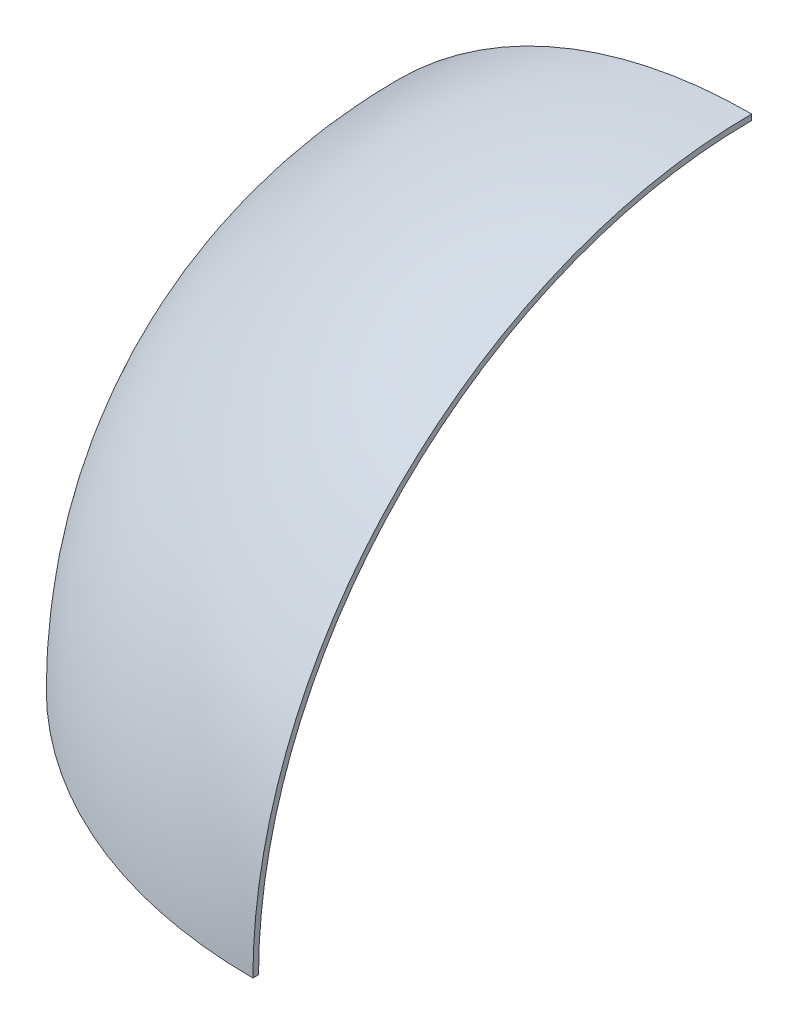
ISO-10303-21;
HEADER;
FILE_DESCRIPTION(('STEP AP214'),'2;1');
FILE_NAME('part.step','',(''),(''),'','','');
FILE_SCHEMA(('AUTOMOTIVE_DESIGN { 1 0 10303 214 1 1 1 1 }'));
ENDSEC;
DATA;
#1=APPLICATION_CONTEXT('core data for automotive mechanical design processes');
#2=APPLICATION_PROTOCOL_DEFINITION('international standard','automotive_design',2000,#1);
#3=PRODUCT_CONTEXT('',#1,'mechanical');
#4=PRODUCT('Part','Part','',(#3));
#5=PRODUCT_RELATED_PRODUCT_CATEGORY('part','',(#4));
#6=PRODUCT_DEFINITION_FORMATION('','',#4);
#7=PRODUCT_DEFINITION_CONTEXT('part definition',#1,'design');
#8=PRODUCT_DEFINITION('design','',#6,#7);
#9=PRODUCT_DEFINITION_SHAPE('','',#8);
#10=(LENGTH_UNIT() NAMED_UNIT(*) SI_UNIT(.MILLI.,.METRE.));
#11=(NAMED_UNIT(*) PLANE_ANGLE_UNIT() SI_UNIT($,.RADIAN.));
#12=(NAMED_UNIT(*) SI_UNIT($,.STERADIAN.) SOLID_ANGLE_UNIT());
#13=UNCERTAINTY_MEASURE_WITH_UNIT(LENGTH_MEASURE(1.E-05),#10,'distance_accuracy_value','');
#14=(GEOMETRIC_REPRESENTATION_CONTEXT(3) GLOBAL_UNCERTAINTY_ASSIGNED_CONTEXT((#13)) GLOBAL_UNIT_ASSIGNED_CONTEXT((#10,
#11,#12)) REPRESENTATION_CONTEXT('',''));
#15=CARTESIAN_POINT('',(0.,0.,0.));
#16=DIRECTION('',(0.,0.,1.));
#17=DIRECTION('',(1.,0.,0.));
#18=AXIS2_PLACEMENT_3D('',#15,#16,#17);
#19=CARTESIAN_POINT('',(0.,0.,0.));
#20=DIRECTION('',(0.,-1.,0.));
#21=DIRECTION('',(0.,0.,1.));
#22=AXIS2_PLACEMENT_3D('',#19,#20,#21);
#23=SPHERICAL_SURFACE('',#22,87.);
#24=CARTESIAN_POINT('',(0.,0.,0.));
#25=DIRECTION('',(0.,0.,-1.));
#26=DIRECTION('',(1.,0.,0.));
#27=AXIS2_PLACEMENT_3D('',#24,#25,#26);
#28=CIRCLE('',#27,87.);
#29=CARTESIAN_POINT('',(-87.,0.,0.));
#30=VERTEX_POINT('',#29);
#31=CARTESIAN_POINT('',(0.,87.,0.));
#32=VERTEX_POINT('',#31);
#33=EDGE_CURVE('E72',#30,#32,#28,.T.);
#34=ORIENTED_EDGE('',*,*,#33,.T.);
#35=CARTESIAN_POINT('',(0.,0.,0.));
#36=DIRECTION('',(-1.,0.,0.));
#37=DIRECTION('',(0.,0.,-1.));
#38=AXIS2_PLACEMENT_3D('',#35,#36,#37);
#39=CIRCLE('',#38,87.);
#40=CARTESIAN_POINT('',(3.03758876479353E-13,0.,87.));
#41=VERTEX_POINT('',#40);
#42=EDGE_CURVE('E77',#41,#32,#39,.T.);
#43=ORIENTED_EDGE('',*,*,#42,.F.);
#44=CARTESIAN_POINT('',(0.,0.,0.));
#45=DIRECTION('',(0.,-1.,0.));
#46=DIRECTION('',(1.,0.,0.));
#47=AXIS2_PLACEMENT_3D('',#44,#45,#46);
#48=CIRCLE('',#47,87.);
#49=EDGE_CURVE('E40',#41,#30,#48,.T.);
#50=ORIENTED_EDGE('',*,*,#49,.T.);
#51=EDGE_LOOP('',(#34,#43,#50));
#52=FACE_BOUND('',#51,.T.);
#53=ADVANCED_FACE('F32',(#52),#23,.F.);
#54=CARTESIAN_POINT('',(0.,0.,0.));
#55=DIRECTION('',(0.,-1.,0.));
#56=DIRECTION('',(0.,0.,1.));
#57=AXIS2_PLACEMENT_3D('',#54,#55,#56);
#58=SPHERICAL_SURFACE('',#57,88.);
#59=CARTESIAN_POINT('',(0.,0.,0.));
#60=DIRECTION('',(0.,-1.,0.));
#61=DIRECTION('',(1.,0.,0.));
#62=AXIS2_PLACEMENT_3D('',#59,#60,#61);
#63=CIRCLE('',#62,88.);
#64=CARTESIAN_POINT('',(3.07250357818196E-13,0.,88.));
#65=VERTEX_POINT('',#64);
#66=CARTESIAN_POINT('',(-88.,0.,0.));
#67=VERTEX_POINT('',#66);
#68=EDGE_CURVE('E11',#65,#67,#63,.T.);
#69=ORIENTED_EDGE('',*,*,#68,.F.);
#70=CARTESIAN_POINT('',(0.,0.,0.));
#71=DIRECTION('',(1.,0.,0.));
#72=DIRECTION('',(0.,0.,-1.));
#73=AXIS2_PLACEMENT_3D('',#70,#71,#72);
#74=CIRCLE('',#73,88.);
#75=CARTESIAN_POINT('',(0.,88.,0.));
#76=VERTEX_POINT('',#75);
#77=EDGE_CURVE('E69',#76,#65,#74,.T.);
#78=ORIENTED_EDGE('',*,*,#77,.F.);
#79=CARTESIAN_POINT('',(0.,0.,0.));
#80=DIRECTION('',(0.,0.,1.));
#81=DIRECTION('',(1.,0.,0.));
#82=AXIS2_PLACEMENT_3D('',#79,#80,#81);
#83=CIRCLE('',#82,88.);
#84=EDGE_CURVE('E68',#76,#67,#83,.T.);
#85=ORIENTED_EDGE('',*,*,#84,.T.);
#86=EDGE_LOOP('',(#69,#78,#85));
#87=FACE_BOUND('',#86,.T.);
#88=ADVANCED_FACE('F34',(#87),#58,.T.);
#89=CARTESIAN_POINT('',(3.07250357818196E-13,0.,88.));
#90=DIRECTION('',(0.,1.,0.));
#91=DIRECTION('',(-1.,0.,0.));
#92=AXIS2_PLACEMENT_3D('',#89,#90,#91);
#93=PLANE('',#92);
#94=DIRECTION('',(0.,0.,-1.));
#95=VECTOR('',#94,1.);
#96=CARTESIAN_POINT('',(3.07250357818196E-13,0.,88.));
#97=LINE('',#96,#95);
#98=EDGE_CURVE('E67',#65,#41,#97,.T.);
#99=ORIENTED_EDGE('',*,*,#98,.F.);
#100=ORIENTED_EDGE('',*,*,#68,.T.);
#101=DIRECTION('',(1.,0.,0.));
#102=VECTOR('',#101,1.);
#103=CARTESIAN_POINT('',(-88.,0.,0.));
#104=LINE('',#103,#102);
#105=EDGE_CURVE('E65',#67,#30,#104,.T.);
#106=ORIENTED_EDGE('',*,*,#105,.T.);
#107=ORIENTED_EDGE('',*,*,#49,.F.);
#108=EDGE_LOOP('',(#99,#100,#106,#107));
#109=FACE_BOUND('',#108,.T.);
#110=ADVANCED_FACE('F63',(#109),#93,.F.);
#111=CARTESIAN_POINT('',(0.,0.,0.));
#112=DIRECTION('',(1.,0.,0.));
#113=DIRECTION('',(0.,0.,-1.));
#114=AXIS2_PLACEMENT_3D('',#111,#112,#113);
#115=PLANE('',#114);
#116=ORIENTED_EDGE('',*,*,#42,.T.);
#117=DIRECTION('',(0.,1.,0.));
#118=VECTOR('',#117,1.);
#119=CARTESIAN_POINT('',(0.,87.,0.));
#120=LINE('',#119,#118);
#121=EDGE_CURVE('E80',#32,#76,#120,.T.);
#122=ORIENTED_EDGE('',*,*,#121,.T.);
#123=ORIENTED_EDGE('',*,*,#77,.T.);
#124=ORIENTED_EDGE('',*,*,#98,.T.);
#125=EDGE_LOOP('',(#116,#122,#123,#124));
#126=FACE_BOUND('',#125,.T.);
#127=ADVANCED_FACE('F88',(#126),#115,.T.);
#128=CARTESIAN_POINT('',(0.,0.,0.));
#129=DIRECTION('',(0.,0.,1.));
#130=DIRECTION('',(1.,0.,0.));
#131=AXIS2_PLACEMENT_3D('',#128,#129,#130);
#132=PLANE('',#131);
#133=ORIENTED_EDGE('',*,*,#33,.F.);
#134=ORIENTED_EDGE('',*,*,#105,.F.);
#135=ORIENTED_EDGE('',*,*,#84,.F.);
#136=ORIENTED_EDGE('',*,*,#121,.F.);
#137=EDGE_LOOP('',(#133,#134,#135,#136));
#138=FACE_BOUND('',#137,.T.);
#139=ADVANCED_FACE('F75',(#138),#132,.F.);
#140=CLOSED_SHELL('',(#53,#88,#110,#127,#139));
#141=MANIFOLD_SOLID_BREP('B2',#140);
#142=ADVANCED_BREP_SHAPE_REPRESENTATION('',(#18,#141),#14);
#143=SHAPE_DEFINITION_REPRESENTATION(#9,#142);
ENDSEC;
END-ISO-10303-21;
